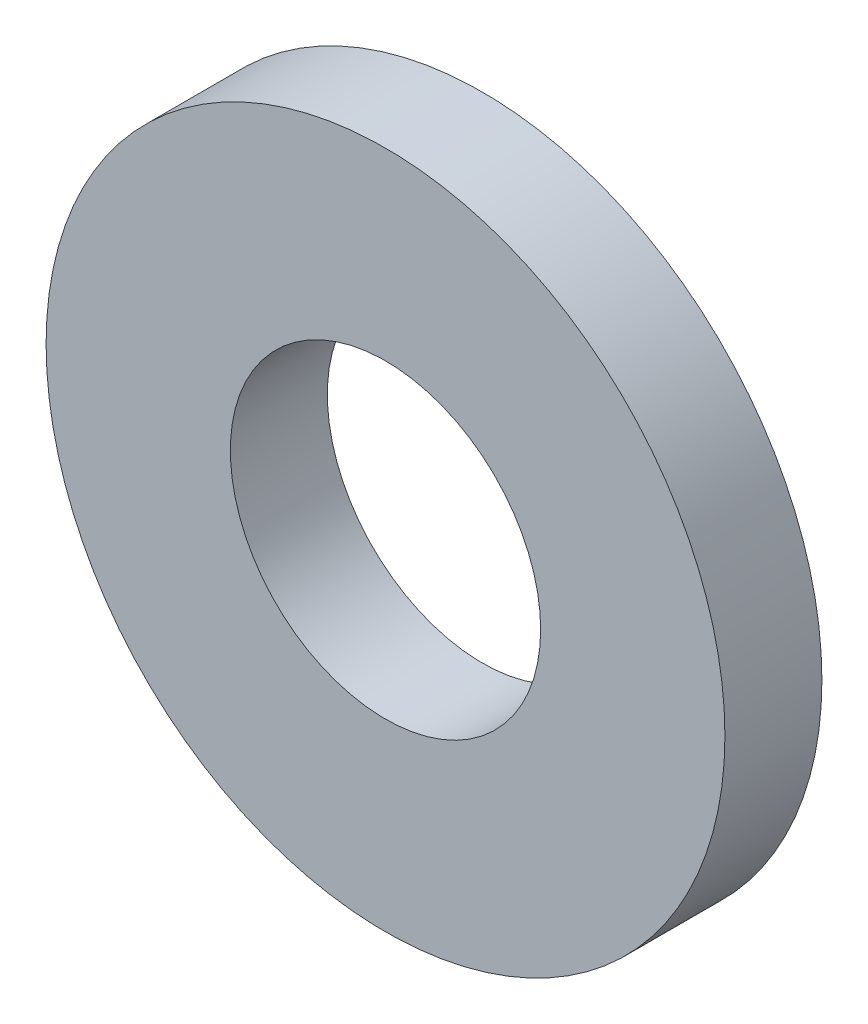
ISO-10303-21;
HEADER;
FILE_DESCRIPTION(('STEP AP214'),'2;1');
FILE_NAME('part.step','',(''),(''),'','','');
FILE_SCHEMA(('AUTOMOTIVE_DESIGN { 1 0 10303 214 1 1 1 1 }'));
ENDSEC;
DATA;
#1=APPLICATION_CONTEXT('core data for automotive mechanical design processes');
#2=APPLICATION_PROTOCOL_DEFINITION('international standard','automotive_design',2000,#1);
#3=PRODUCT_CONTEXT('',#1,'mechanical');
#4=PRODUCT('Part','Part','',(#3));
#5=PRODUCT_RELATED_PRODUCT_CATEGORY('part','',(#4));
#6=PRODUCT_DEFINITION_FORMATION('','',#4);
#7=PRODUCT_DEFINITION_CONTEXT('part definition',#1,'design');
#8=PRODUCT_DEFINITION('design','',#6,#7);
#9=PRODUCT_DEFINITION_SHAPE('','',#8);
#10=(LENGTH_UNIT() NAMED_UNIT(*) SI_UNIT(.MILLI.,.METRE.));
#11=(NAMED_UNIT(*) PLANE_ANGLE_UNIT() SI_UNIT($,.RADIAN.));
#12=(NAMED_UNIT(*) SI_UNIT($,.STERADIAN.) SOLID_ANGLE_UNIT());
#13=UNCERTAINTY_MEASURE_WITH_UNIT(LENGTH_MEASURE(1.E-05),#10,'distance_accuracy_value','');
#14=(GEOMETRIC_REPRESENTATION_CONTEXT(3) GLOBAL_UNCERTAINTY_ASSIGNED_CONTEXT((#13)) GLOBAL_UNIT_ASSIGNED_CONTEXT((#10,
#11,#12)) REPRESENTATION_CONTEXT('',''));
#15=CARTESIAN_POINT('',(0.,0.,0.));
#16=DIRECTION('',(0.,0.,1.));
#17=DIRECTION('',(1.,0.,0.));
#18=AXIS2_PLACEMENT_3D('',#15,#16,#17);
#19=CARTESIAN_POINT('',(0.,0.,0.999999999999918));
#20=DIRECTION('',(0.,0.,1.));
#21=DIRECTION('',(1.,0.,0.));
#22=AXIS2_PLACEMENT_3D('',#19,#20,#21);
#23=PLANE('',#22);
#24=CARTESIAN_POINT('',(0.,0.,0.999999999999918));
#25=DIRECTION('',(0.,0.,1.));
#26=DIRECTION('',(1.,0.,0.));
#27=AXIS2_PLACEMENT_3D('',#24,#25,#26);
#28=CIRCLE('',#27,3.5);
#29=CARTESIAN_POINT('',(3.50000000000001,0.,0.999999999999913));
#30=VERTEX_POINT('',#29);
#31=EDGE_CURVE('E10',#30,#30,#28,.T.);
#32=ORIENTED_EDGE('',*,*,#31,.T.);
#33=EDGE_LOOP('',(#32));
#34=FACE_BOUND('',#33,.T.);
#35=CARTESIAN_POINT('',(0.,0.,0.999999999999918));
#36=DIRECTION('',(0.,0.,1.));
#37=DIRECTION('',(1.,0.,0.));
#38=AXIS2_PLACEMENT_3D('',#35,#36,#37);
#39=CIRCLE('',#38,1.6);
#40=CARTESIAN_POINT('',(1.6,0.,0.999999999999916));
#41=VERTEX_POINT('',#40);
#42=EDGE_CURVE('E41',#41,#41,#39,.T.);
#43=ORIENTED_EDGE('',*,*,#42,.F.);
#44=EDGE_LOOP('',(#43));
#45=FACE_BOUND('',#44,.T.);
#46=ADVANCED_FACE('F30',(#34,#45),#23,.T.);
#47=CARTESIAN_POINT('',(0.,0.,0.));
#48=DIRECTION('',(0.,0.,1.));
#49=DIRECTION('',(1.,0.,0.));
#50=AXIS2_PLACEMENT_3D('',#47,#48,#49);
#51=PLANE('',#50);
#52=CARTESIAN_POINT('',(0.,0.,0.));
#53=DIRECTION('',(0.,0.,1.));
#54=DIRECTION('',(1.,0.,0.));
#55=AXIS2_PLACEMENT_3D('',#52,#53,#54);
#56=CIRCLE('',#55,3.5);
#57=CARTESIAN_POINT('',(3.50000000000001,0.,0.));
#58=VERTEX_POINT('',#57);
#59=EDGE_CURVE('E34',#58,#58,#56,.T.);
#60=ORIENTED_EDGE('',*,*,#59,.F.);
#61=EDGE_LOOP('',(#60));
#62=FACE_BOUND('',#61,.T.);
#63=CARTESIAN_POINT('',(0.,0.,0.));
#64=DIRECTION('',(0.,0.,1.));
#65=DIRECTION('',(1.,0.,0.));
#66=AXIS2_PLACEMENT_3D('',#63,#64,#65);
#67=CIRCLE('',#66,1.6);
#68=CARTESIAN_POINT('',(1.6,0.,0.));
#69=VERTEX_POINT('',#68);
#70=EDGE_CURVE('E43',#69,#69,#67,.T.);
#71=ORIENTED_EDGE('',*,*,#70,.T.);
#72=EDGE_LOOP('',(#71));
#73=FACE_BOUND('',#72,.T.);
#74=ADVANCED_FACE('F53',(#62,#73),#51,.F.);
#75=CARTESIAN_POINT('',(0.,0.,0.999999999999918));
#76=DIRECTION('',(0.,0.,-1.));
#77=DIRECTION('',(-1.,0.,0.));
#78=AXIS2_PLACEMENT_3D('',#75,#76,#77);
#79=CYLINDRICAL_SURFACE('',#78,3.5);
#80=ORIENTED_EDGE('',*,*,#31,.F.);
#81=EDGE_LOOP('',(#80));
#82=FACE_BOUND('',#81,.T.);
#83=ORIENTED_EDGE('',*,*,#59,.T.);
#84=EDGE_LOOP('',(#83));
#85=FACE_BOUND('',#84,.T.);
#86=ADVANCED_FACE('F32',(#82,#85),#79,.T.);
#87=CARTESIAN_POINT('',(0.,0.,0.999999999999918));
#88=DIRECTION('',(0.,0.,-1.));
#89=DIRECTION('',(-1.,0.,0.));
#90=AXIS2_PLACEMENT_3D('',#87,#88,#89);
#91=CYLINDRICAL_SURFACE('',#90,1.6);
#92=ORIENTED_EDGE('',*,*,#42,.T.);
#93=EDGE_LOOP('',(#92));
#94=FACE_BOUND('',#93,.T.);
#95=ORIENTED_EDGE('',*,*,#70,.F.);
#96=EDGE_LOOP('',(#95));
#97=FACE_BOUND('',#96,.T.);
#98=ADVANCED_FACE('F49',(#94,#97),#91,.F.);
#99=CLOSED_SHELL('',(#46,#74,#86,#98));
#100=MANIFOLD_SOLID_BREP('B2',#99);
#101=ADVANCED_BREP_SHAPE_REPRESENTATION('',(#18,#100),#14);
#102=SHAPE_DEFINITION_REPRESENTATION(#9,#101);
ENDSEC;
END-ISO-10303-21;
